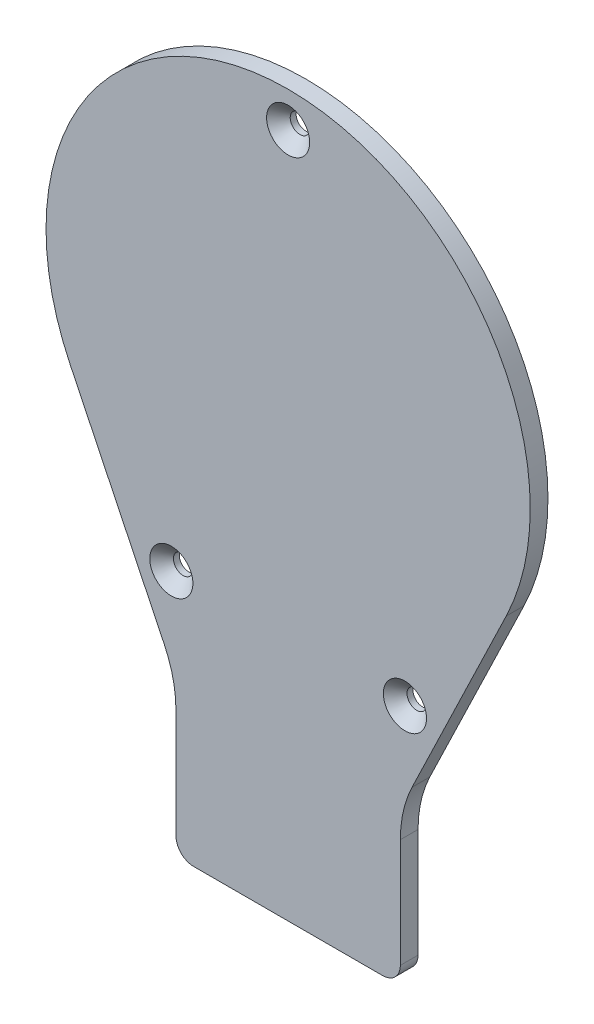
ISO-10303-21;
HEADER;
FILE_DESCRIPTION(('STEP AP214'),'2;1');
FILE_NAME('part.step','',(''),(''),'','','');
FILE_SCHEMA(('AUTOMOTIVE_DESIGN { 1 0 10303 214 1 1 1 1 }'));
ENDSEC;
DATA;
#1=APPLICATION_CONTEXT('core data for automotive mechanical design processes');
#2=APPLICATION_PROTOCOL_DEFINITION('international standard','automotive_design',2000,#1);
#3=PRODUCT_CONTEXT('',#1,'mechanical');
#4=PRODUCT('Part','Part','',(#3));
#5=PRODUCT_RELATED_PRODUCT_CATEGORY('part','',(#4));
#6=PRODUCT_DEFINITION_FORMATION('','',#4);
#7=PRODUCT_DEFINITION_CONTEXT('part definition',#1,'design');
#8=PRODUCT_DEFINITION('design','',#6,#7);
#9=PRODUCT_DEFINITION_SHAPE('','',#8);
#10=(LENGTH_UNIT() NAMED_UNIT(*) SI_UNIT(.MILLI.,.METRE.));
#11=(NAMED_UNIT(*) PLANE_ANGLE_UNIT() SI_UNIT($,.RADIAN.));
#12=(NAMED_UNIT(*) SI_UNIT($,.STERADIAN.) SOLID_ANGLE_UNIT());
#13=UNCERTAINTY_MEASURE_WITH_UNIT(LENGTH_MEASURE(1.E-05),#10,'distance_accuracy_value','');
#14=(GEOMETRIC_REPRESENTATION_CONTEXT(3) GLOBAL_UNCERTAINTY_ASSIGNED_CONTEXT((#13)) GLOBAL_UNIT_ASSIGNED_CONTEXT((#10,
#11,#12)) REPRESENTATION_CONTEXT('',''));
#15=CARTESIAN_POINT('',(0.,0.,0.));
#16=DIRECTION('',(0.,0.,1.));
#17=DIRECTION('',(1.,0.,0.));
#18=AXIS2_PLACEMENT_3D('',#15,#16,#17);
#19=CARTESIAN_POINT('',(-16.,3.,3.));
#20=DIRECTION('',(0.,0.,1.));
#21=DIRECTION('',(1.,0.,0.));
#22=AXIS2_PLACEMENT_3D('',#19,#20,#21);
#23=PLANE('',#22);
#24=CARTESIAN_POINT('',(19.7801424293768,41.4342760581103,3.));
#25=DIRECTION('',(0.,0.,1.));
#26=DIRECTION('',(1.,0.,0.));
#27=AXIS2_PLACEMENT_3D('',#24,#25,#26);
#28=CIRCLE('',#27,3.65000000000003);
#29=CARTESIAN_POINT('',(23.4301424293768,41.4342760581103,3.));
#30=VERTEX_POINT('',#29);
#31=EDGE_CURVE('E194',#30,#30,#28,.F.);
#32=ORIENTED_EDGE('',*,*,#31,.T.);
#33=EDGE_LOOP('',(#32));
#34=FACE_BOUND('',#33,.T.);
#35=CARTESIAN_POINT('',(-19.7801424293768,41.4342760581103,3.));
#36=DIRECTION('',(0.,0.,1.));
#37=DIRECTION('',(1.,0.,0.));
#38=AXIS2_PLACEMENT_3D('',#35,#36,#37);
#39=CIRCLE('',#38,3.65000000000003);
#40=CARTESIAN_POINT('',(-16.1301424293767,41.4342760581103,3.));
#41=VERTEX_POINT('',#40);
#42=EDGE_CURVE('E191',#41,#41,#39,.F.);
#43=ORIENTED_EDGE('',*,*,#42,.T.);
#44=EDGE_LOOP('',(#43));
#45=FACE_BOUND('',#44,.T.);
#46=CARTESIAN_POINT('',(0.,116.,3.));
#47=DIRECTION('',(0.,0.,1.));
#48=DIRECTION('',(1.,0.,0.));
#49=AXIS2_PLACEMENT_3D('',#46,#47,#48);
#50=CIRCLE('',#49,3.65000000000003);
#51=CARTESIAN_POINT('',(3.65000000000003,116.,3.));
#52=VERTEX_POINT('',#51);
#53=EDGE_CURVE('E188',#52,#52,#50,.F.);
#54=ORIENTED_EDGE('',*,*,#53,.T.);
#55=EDGE_LOOP('',(#54));
#56=FACE_BOUND('',#55,.T.);
#57=CARTESIAN_POINT('',(-16.,3.,3.));
#58=DIRECTION('',(0.,0.,1.));
#59=DIRECTION('',(1.,0.,0.));
#60=AXIS2_PLACEMENT_3D('',#57,#58,#59);
#61=CIRCLE('',#60,3.);
#62=CARTESIAN_POINT('',(-19.,3.,3.));
#63=VERTEX_POINT('',#62);
#64=CARTESIAN_POINT('',(-16.,0.,3.));
#65=VERTEX_POINT('',#64);
#66=EDGE_CURVE('E164',#63,#65,#61,.T.);
#67=ORIENTED_EDGE('',*,*,#66,.T.);
#68=DIRECTION('',(1.,0.,0.));
#69=VECTOR('',#68,1.);
#70=CARTESIAN_POINT('',(-16.,0.,3.));
#71=LINE('',#70,#69);
#72=CARTESIAN_POINT('',(16.,0.,3.));
#73=VERTEX_POINT('',#72);
#74=EDGE_CURVE('E103',#65,#73,#71,.T.);
#75=ORIENTED_EDGE('',*,*,#74,.T.);
#76=CARTESIAN_POINT('',(16.,3.,3.));
#77=DIRECTION('',(0.,0.,1.));
#78=DIRECTION('',(1.,0.,0.));
#79=AXIS2_PLACEMENT_3D('',#76,#77,#78);
#80=CIRCLE('',#79,3.);
#81=CARTESIAN_POINT('',(19.,3.,3.));
#82=VERTEX_POINT('',#81);
#83=EDGE_CURVE('E279',#73,#82,#80,.T.);
#84=ORIENTED_EDGE('',*,*,#83,.T.);
#85=DIRECTION('',(0.,1.,0.));
#86=VECTOR('',#85,1.);
#87=CARTESIAN_POINT('',(19.,3.,3.));
#88=LINE('',#87,#86);
#89=CARTESIAN_POINT('',(19.,21.4305485480417,3.));
#90=VERTEX_POINT('',#89);
#91=EDGE_CURVE('E281',#82,#90,#88,.T.);
#92=ORIENTED_EDGE('',*,*,#91,.T.);
#93=CARTESIAN_POINT('',(39.,21.4305485480417,3.));
#94=DIRECTION('',(0.,0.,-1.));
#95=DIRECTION('',(1.,0.,0.));
#96=AXIS2_PLACEMENT_3D('',#93,#94,#95);
#97=CIRCLE('',#96,20.);
#98=CARTESIAN_POINT('',(20.984403364283,30.1160697102486,3.));
#99=VERTEX_POINT('',#98);
#100=EDGE_CURVE('E283',#90,#99,#97,.T.);
#101=ORIENTED_EDGE('',*,*,#100,.T.);
#102=DIRECTION('',(0.434276058110342,0.900779831785849,0.));
#103=VECTOR('',#102,1.);
#104=CARTESIAN_POINT('',(20.984403364283,30.1160697102486,3.));
#105=LINE('',#104,#103);
#106=CARTESIAN_POINT('',(36.9319731032198,63.1946816174759,3.));
#107=VERTEX_POINT('',#106);
#108=EDGE_CURVE('E289',#99,#107,#105,.T.);
#109=ORIENTED_EDGE('',*,*,#108,.T.);
#110=CARTESIAN_POINT('',(0.,81.,3.));
#111=DIRECTION('',(0.,0.,1.));
#112=DIRECTION('',(1.,0.,0.));
#113=AXIS2_PLACEMENT_3D('',#110,#111,#112);
#114=CIRCLE('',#113,41.);
#115=CARTESIAN_POINT('',(-36.9319731032198,63.1946816174759,3.));
#116=VERTEX_POINT('',#115);
#117=EDGE_CURVE('E127',#107,#116,#114,.T.);
#118=ORIENTED_EDGE('',*,*,#117,.T.);
#119=DIRECTION('',(0.434276058110342,-0.900779831785849,0.));
#120=VECTOR('',#119,1.);
#121=CARTESIAN_POINT('',(-36.9319731032198,63.1946816174759,3.));
#122=LINE('',#121,#120);
#123=CARTESIAN_POINT('',(-20.984403364283,30.1160697102485,3.));
#124=VERTEX_POINT('',#123);
#125=EDGE_CURVE('E122',#116,#124,#122,.T.);
#126=ORIENTED_EDGE('',*,*,#125,.T.);
#127=CARTESIAN_POINT('',(-39.,21.4305485480417,3.));
#128=DIRECTION('',(0.,0.,-1.));
#129=DIRECTION('',(1.,0.,0.));
#130=AXIS2_PLACEMENT_3D('',#127,#128,#129);
#131=CIRCLE('',#130,20.);
#132=CARTESIAN_POINT('',(-19.,21.4305485480417,3.));
#133=VERTEX_POINT('',#132);
#134=EDGE_CURVE('E125',#124,#133,#131,.T.);
#135=ORIENTED_EDGE('',*,*,#134,.T.);
#136=DIRECTION('',(0.,-1.,0.));
#137=VECTOR('',#136,1.);
#138=CARTESIAN_POINT('',(-19.,21.4305485480417,3.));
#139=LINE('',#138,#137);
#140=EDGE_CURVE('E53',#133,#63,#139,.T.);
#141=ORIENTED_EDGE('',*,*,#140,.T.);
#142=EDGE_LOOP('',(#67,#75,#84,#92,#101,#109,#118,#126,#135,#141));
#143=FACE_BOUND('',#142,.T.);
#144=ADVANCED_FACE('F35',(#34,#45,#56,#143),#23,.T.);
#145=CARTESIAN_POINT('',(-16.,3.,0.));
#146=DIRECTION('',(0.,0.,1.));
#147=DIRECTION('',(1.,0.,0.));
#148=AXIS2_PLACEMENT_3D('',#145,#146,#147);
#149=PLANE('',#148);
#150=CARTESIAN_POINT('',(-16.,3.,0.));
#151=DIRECTION('',(0.,0.,1.));
#152=DIRECTION('',(1.,0.,0.));
#153=AXIS2_PLACEMENT_3D('',#150,#151,#152);
#154=CIRCLE('',#153,3.);
#155=CARTESIAN_POINT('',(-19.,3.,0.));
#156=VERTEX_POINT('',#155);
#157=CARTESIAN_POINT('',(-16.,0.,0.));
#158=VERTEX_POINT('',#157);
#159=EDGE_CURVE('E145',#156,#158,#154,.T.);
#160=ORIENTED_EDGE('',*,*,#159,.F.);
#161=DIRECTION('',(0.,-1.,0.));
#162=VECTOR('',#161,1.);
#163=CARTESIAN_POINT('',(-19.,21.4305485480417,0.));
#164=LINE('',#163,#162);
#165=CARTESIAN_POINT('',(-19.,21.4305485480417,0.));
#166=VERTEX_POINT('',#165);
#167=EDGE_CURVE('E94',#166,#156,#164,.T.);
#168=ORIENTED_EDGE('',*,*,#167,.F.);
#169=CARTESIAN_POINT('',(-39.,21.4305485480417,0.));
#170=DIRECTION('',(0.,0.,-1.));
#171=DIRECTION('',(1.,0.,0.));
#172=AXIS2_PLACEMENT_3D('',#169,#170,#171);
#173=CIRCLE('',#172,20.);
#174=CARTESIAN_POINT('',(-20.984403364283,30.1160697102485,0.));
#175=VERTEX_POINT('',#174);
#176=EDGE_CURVE('E88',#175,#166,#173,.T.);
#177=ORIENTED_EDGE('',*,*,#176,.F.);
#178=DIRECTION('',(0.434276058110342,-0.900779831785849,0.));
#179=VECTOR('',#178,1.);
#180=CARTESIAN_POINT('',(-36.9319731032198,63.1946816174759,0.));
#181=LINE('',#180,#179);
#182=CARTESIAN_POINT('',(-36.9319731032198,63.1946816174759,0.));
#183=VERTEX_POINT('',#182);
#184=EDGE_CURVE('E135',#183,#175,#181,.T.);
#185=ORIENTED_EDGE('',*,*,#184,.F.);
#186=CARTESIAN_POINT('',(0.,81.,0.));
#187=DIRECTION('',(0.,0.,1.));
#188=DIRECTION('',(1.,0.,0.));
#189=AXIS2_PLACEMENT_3D('',#186,#187,#188);
#190=CIRCLE('',#189,41.);
#191=CARTESIAN_POINT('',(36.9319731032198,63.1946816174759,0.));
#192=VERTEX_POINT('',#191);
#193=EDGE_CURVE('E159',#192,#183,#190,.T.);
#194=ORIENTED_EDGE('',*,*,#193,.F.);
#195=DIRECTION('',(0.434276058110342,0.900779831785849,0.));
#196=VECTOR('',#195,1.);
#197=CARTESIAN_POINT('',(20.984403364283,30.1160697102486,0.));
#198=LINE('',#197,#196);
#199=CARTESIAN_POINT('',(20.984403364283,30.1160697102486,0.));
#200=VERTEX_POINT('',#199);
#201=EDGE_CURVE('E157',#200,#192,#198,.T.);
#202=ORIENTED_EDGE('',*,*,#201,.F.);
#203=CARTESIAN_POINT('',(39.,21.4305485480417,0.));
#204=DIRECTION('',(0.,0.,-1.));
#205=DIRECTION('',(1.,0.,0.));
#206=AXIS2_PLACEMENT_3D('',#203,#204,#205);
#207=CIRCLE('',#206,20.);
#208=CARTESIAN_POINT('',(19.,21.4305485480417,0.));
#209=VERTEX_POINT('',#208);
#210=EDGE_CURVE('E155',#209,#200,#207,.T.);
#211=ORIENTED_EDGE('',*,*,#210,.F.);
#212=DIRECTION('',(0.,1.,0.));
#213=VECTOR('',#212,1.);
#214=CARTESIAN_POINT('',(19.,3.,0.));
#215=LINE('',#214,#213);
#216=CARTESIAN_POINT('',(19.,3.,0.));
#217=VERTEX_POINT('',#216);
#218=EDGE_CURVE('E153',#217,#209,#215,.T.);
#219=ORIENTED_EDGE('',*,*,#218,.F.);
#220=CARTESIAN_POINT('',(16.,3.,0.));
#221=DIRECTION('',(0.,0.,1.));
#222=DIRECTION('',(1.,0.,0.));
#223=AXIS2_PLACEMENT_3D('',#220,#221,#222);
#224=CIRCLE('',#223,3.);
#225=CARTESIAN_POINT('',(16.,0.,0.));
#226=VERTEX_POINT('',#225);
#227=EDGE_CURVE('E151',#226,#217,#224,.T.);
#228=ORIENTED_EDGE('',*,*,#227,.F.);
#229=DIRECTION('',(1.,0.,0.));
#230=VECTOR('',#229,1.);
#231=CARTESIAN_POINT('',(-16.,0.,0.));
#232=LINE('',#231,#230);
#233=EDGE_CURVE('E148',#158,#226,#232,.T.);
#234=ORIENTED_EDGE('',*,*,#233,.F.);
#235=EDGE_LOOP('',(#160,#168,#177,#185,#194,#202,#211,#219,#228,#234));
#236=FACE_BOUND('',#235,.T.);
#237=CARTESIAN_POINT('',(0.,116.,0.));
#238=DIRECTION('',(0.,0.,1.));
#239=DIRECTION('',(1.,0.,0.));
#240=AXIS2_PLACEMENT_3D('',#237,#238,#239);
#241=CIRCLE('',#240,1.65);
#242=CARTESIAN_POINT('',(1.65,116.,0.));
#243=VERTEX_POINT('',#242);
#244=EDGE_CURVE('E149',#243,#243,#241,.T.);
#245=ORIENTED_EDGE('',*,*,#244,.T.);
#246=EDGE_LOOP('',(#245));
#247=FACE_BOUND('',#246,.T.);
#248=CARTESIAN_POINT('',(19.7801424293768,41.4342760581103,0.));
#249=DIRECTION('',(0.,0.,1.));
#250=DIRECTION('',(1.,0.,0.));
#251=AXIS2_PLACEMENT_3D('',#248,#249,#250);
#252=CIRCLE('',#251,1.65);
#253=CARTESIAN_POINT('',(21.4301424293768,41.4342760581103,0.));
#254=VERTEX_POINT('',#253);
#255=EDGE_CURVE('E301',#254,#254,#252,.T.);
#256=ORIENTED_EDGE('',*,*,#255,.T.);
#257=EDGE_LOOP('',(#256));
#258=FACE_BOUND('',#257,.T.);
#259=CARTESIAN_POINT('',(-19.7801424293768,41.4342760581103,0.));
#260=DIRECTION('',(0.,0.,1.));
#261=DIRECTION('',(1.,0.,0.));
#262=AXIS2_PLACEMENT_3D('',#259,#260,#261);
#263=CIRCLE('',#262,1.65);
#264=CARTESIAN_POINT('',(-18.1301424293768,41.4342760581103,0.));
#265=VERTEX_POINT('',#264);
#266=EDGE_CURVE('E304',#265,#265,#263,.T.);
#267=ORIENTED_EDGE('',*,*,#266,.T.);
#268=EDGE_LOOP('',(#267));
#269=FACE_BOUND('',#268,.T.);
#270=ADVANCED_FACE('F216',(#236,#247,#258,#269),#149,.F.);
#271=CARTESIAN_POINT('',(-16.,3.,3.));
#272=DIRECTION('',(0.,0.,-1.));
#273=DIRECTION('',(-1.,0.,0.));
#274=AXIS2_PLACEMENT_3D('',#271,#272,#273);
#275=CYLINDRICAL_SURFACE('',#274,3.);
#276=ORIENTED_EDGE('',*,*,#159,.T.);
#277=DIRECTION('',(0.,0.,-1.));
#278=VECTOR('',#277,1.);
#279=CARTESIAN_POINT('',(-16.,0.,3.));
#280=LINE('',#279,#278);
#281=EDGE_CURVE('E183',#65,#158,#280,.T.);
#282=ORIENTED_EDGE('',*,*,#281,.F.);
#283=ORIENTED_EDGE('',*,*,#66,.F.);
#284=DIRECTION('',(0.,0.,-1.));
#285=VECTOR('',#284,1.);
#286=CARTESIAN_POINT('',(-19.,3.,3.));
#287=LINE('',#286,#285);
#288=EDGE_CURVE('E141',#63,#156,#287,.T.);
#289=ORIENTED_EDGE('',*,*,#288,.T.);
#290=EDGE_LOOP('',(#276,#282,#283,#289));
#291=FACE_BOUND('',#290,.T.);
#292=ADVANCED_FACE('F222',(#291),#275,.T.);
#293=CARTESIAN_POINT('',(-16.,0.,3.));
#294=DIRECTION('',(0.,1.,0.));
#295=DIRECTION('',(0.,0.,1.));
#296=AXIS2_PLACEMENT_3D('',#293,#294,#295);
#297=PLANE('',#296);
#298=ORIENTED_EDGE('',*,*,#233,.T.);
#299=DIRECTION('',(0.,0.,-1.));
#300=VECTOR('',#299,1.);
#301=CARTESIAN_POINT('',(16.,0.,3.));
#302=LINE('',#301,#300);
#303=EDGE_CURVE('E180',#73,#226,#302,.T.);
#304=ORIENTED_EDGE('',*,*,#303,.F.);
#305=ORIENTED_EDGE('',*,*,#74,.F.);
#306=ORIENTED_EDGE('',*,*,#281,.T.);
#307=EDGE_LOOP('',(#298,#304,#305,#306));
#308=FACE_BOUND('',#307,.T.);
#309=ADVANCED_FACE('F256',(#308),#297,.F.);
#310=CARTESIAN_POINT('',(16.,3.,3.));
#311=DIRECTION('',(0.,0.,-1.));
#312=DIRECTION('',(-1.,0.,0.));
#313=AXIS2_PLACEMENT_3D('',#310,#311,#312);
#314=CYLINDRICAL_SURFACE('',#313,3.);
#315=ORIENTED_EDGE('',*,*,#227,.T.);
#316=DIRECTION('',(0.,0.,-1.));
#317=VECTOR('',#316,1.);
#318=CARTESIAN_POINT('',(19.,3.,3.));
#319=LINE('',#318,#317);
#320=EDGE_CURVE('E177',#82,#217,#319,.T.);
#321=ORIENTED_EDGE('',*,*,#320,.F.);
#322=ORIENTED_EDGE('',*,*,#83,.F.);
#323=ORIENTED_EDGE('',*,*,#303,.T.);
#324=EDGE_LOOP('',(#315,#321,#322,#323));
#325=FACE_BOUND('',#324,.T.);
#326=ADVANCED_FACE('F252',(#325),#314,.T.);
#327=CARTESIAN_POINT('',(19.,3.,3.));
#328=DIRECTION('',(-1.,0.,0.));
#329=DIRECTION('',(0.,0.,1.));
#330=AXIS2_PLACEMENT_3D('',#327,#328,#329);
#331=PLANE('',#330);
#332=ORIENTED_EDGE('',*,*,#218,.T.);
#333=DIRECTION('',(0.,0.,-1.));
#334=VECTOR('',#333,1.);
#335=CARTESIAN_POINT('',(19.,21.4305485480417,3.));
#336=LINE('',#335,#334);
#337=EDGE_CURVE('E174',#90,#209,#336,.T.);
#338=ORIENTED_EDGE('',*,*,#337,.F.);
#339=ORIENTED_EDGE('',*,*,#91,.F.);
#340=ORIENTED_EDGE('',*,*,#320,.T.);
#341=EDGE_LOOP('',(#332,#338,#339,#340));
#342=FACE_BOUND('',#341,.T.);
#343=ADVANCED_FACE('F248',(#342),#331,.F.);
#344=CARTESIAN_POINT('',(39.,21.4305485480417,3.));
#345=DIRECTION('',(0.,0.,-1.));
#346=DIRECTION('',(-1.,0.,0.));
#347=AXIS2_PLACEMENT_3D('',#344,#345,#346);
#348=CYLINDRICAL_SURFACE('',#347,20.);
#349=ORIENTED_EDGE('',*,*,#210,.T.);
#350=DIRECTION('',(0.,0.,-1.));
#351=VECTOR('',#350,1.);
#352=CARTESIAN_POINT('',(20.984403364283,30.1160697102486,3.));
#353=LINE('',#352,#351);
#354=EDGE_CURVE('E171',#99,#200,#353,.T.);
#355=ORIENTED_EDGE('',*,*,#354,.F.);
#356=ORIENTED_EDGE('',*,*,#100,.F.);
#357=ORIENTED_EDGE('',*,*,#337,.T.);
#358=EDGE_LOOP('',(#349,#355,#356,#357));
#359=FACE_BOUND('',#358,.T.);
#360=ADVANCED_FACE('F244',(#359),#348,.F.);
#361=CARTESIAN_POINT('',(20.984403364283,30.1160697102486,3.));
#362=DIRECTION('',(-0.900779831785849,0.434276058110342,0.));
#363=DIRECTION('',(-0.434276058110343,-0.900779831785849,0.));
#364=AXIS2_PLACEMENT_3D('',#361,#362,#363);
#365=PLANE('',#364);
#366=ORIENTED_EDGE('',*,*,#201,.T.);
#367=DIRECTION('',(0.,0.,-1.));
#368=VECTOR('',#367,1.);
#369=CARTESIAN_POINT('',(36.9319731032198,63.1946816174759,3.));
#370=LINE('',#369,#368);
#371=EDGE_CURVE('E168',#107,#192,#370,.T.);
#372=ORIENTED_EDGE('',*,*,#371,.F.);
#373=ORIENTED_EDGE('',*,*,#108,.F.);
#374=ORIENTED_EDGE('',*,*,#354,.T.);
#375=EDGE_LOOP('',(#366,#372,#373,#374));
#376=FACE_BOUND('',#375,.T.);
#377=ADVANCED_FACE('F240',(#376),#365,.F.);
#378=CARTESIAN_POINT('',(0.,81.,3.));
#379=DIRECTION('',(0.,0.,-1.));
#380=DIRECTION('',(-1.,0.,0.));
#381=AXIS2_PLACEMENT_3D('',#378,#379,#380);
#382=CYLINDRICAL_SURFACE('',#381,41.);
#383=ORIENTED_EDGE('',*,*,#193,.T.);
#384=DIRECTION('',(0.,0.,-1.));
#385=VECTOR('',#384,1.);
#386=CARTESIAN_POINT('',(-36.9319731032198,63.1946816174759,3.));
#387=LINE('',#386,#385);
#388=EDGE_CURVE('E136',#116,#183,#387,.T.);
#389=ORIENTED_EDGE('',*,*,#388,.F.);
#390=ORIENTED_EDGE('',*,*,#117,.F.);
#391=ORIENTED_EDGE('',*,*,#371,.T.);
#392=EDGE_LOOP('',(#383,#389,#390,#391));
#393=FACE_BOUND('',#392,.T.);
#394=ADVANCED_FACE('F237',(#393),#382,.T.);
#395=CARTESIAN_POINT('',(-36.9319731032198,63.1946816174759,3.));
#396=DIRECTION('',(0.900779831785849,0.434276058110342,0.));
#397=DIRECTION('',(-0.434276058110342,0.900779831785849,0.));
#398=AXIS2_PLACEMENT_3D('',#395,#396,#397);
#399=PLANE('',#398);
#400=ORIENTED_EDGE('',*,*,#184,.T.);
#401=DIRECTION('',(0.,0.,-1.));
#402=VECTOR('',#401,1.);
#403=CARTESIAN_POINT('',(-20.984403364283,30.1160697102485,3.));
#404=LINE('',#403,#402);
#405=EDGE_CURVE('E132',#124,#175,#404,.T.);
#406=ORIENTED_EDGE('',*,*,#405,.F.);
#407=ORIENTED_EDGE('',*,*,#125,.F.);
#408=ORIENTED_EDGE('',*,*,#388,.T.);
#409=EDGE_LOOP('',(#400,#406,#407,#408));
#410=FACE_BOUND('',#409,.T.);
#411=ADVANCED_FACE('F133',(#410),#399,.F.);
#412=CARTESIAN_POINT('',(-39.,21.4305485480417,3.));
#413=DIRECTION('',(0.,0.,-1.));
#414=DIRECTION('',(-1.,0.,0.));
#415=AXIS2_PLACEMENT_3D('',#412,#413,#414);
#416=CYLINDRICAL_SURFACE('',#415,20.);
#417=ORIENTED_EDGE('',*,*,#176,.T.);
#418=DIRECTION('',(0.,0.,-1.));
#419=VECTOR('',#418,1.);
#420=CARTESIAN_POINT('',(-19.,21.4305485480417,3.));
#421=LINE('',#420,#419);
#422=EDGE_CURVE('E137',#133,#166,#421,.T.);
#423=ORIENTED_EDGE('',*,*,#422,.F.);
#424=ORIENTED_EDGE('',*,*,#134,.F.);
#425=ORIENTED_EDGE('',*,*,#405,.T.);
#426=EDGE_LOOP('',(#417,#423,#424,#425));
#427=FACE_BOUND('',#426,.T.);
#428=ADVANCED_FACE('F139',(#427),#416,.F.);
#429=CARTESIAN_POINT('',(-19.,21.4305485480417,3.));
#430=DIRECTION('',(1.,0.,0.));
#431=DIRECTION('',(0.,1.,0.));
#432=AXIS2_PLACEMENT_3D('',#429,#430,#431);
#433=PLANE('',#432);
#434=ORIENTED_EDGE('',*,*,#167,.T.);
#435=ORIENTED_EDGE('',*,*,#288,.F.);
#436=ORIENTED_EDGE('',*,*,#140,.F.);
#437=ORIENTED_EDGE('',*,*,#422,.T.);
#438=EDGE_LOOP('',(#434,#435,#436,#437));
#439=FACE_BOUND('',#438,.T.);
#440=ADVANCED_FACE('F230',(#439),#433,.F.);
#441=CARTESIAN_POINT('',(0.,116.,3.));
#442=DIRECTION('',(0.,0.,-1.));
#443=DIRECTION('',(-1.,0.,0.));
#444=AXIS2_PLACEMENT_3D('',#441,#442,#443);
#445=CYLINDRICAL_SURFACE('',#444,1.65);
#446=CARTESIAN_POINT('',(0.,116.,0.99999999999998));
#447=DIRECTION('',(0.,0.,1.));
#448=DIRECTION('',(1.,0.,0.));
#449=AXIS2_PLACEMENT_3D('',#446,#447,#448);
#450=CIRCLE('',#449,1.65);
#451=CARTESIAN_POINT('',(1.65,116.,0.99999999999998));
#452=VERTEX_POINT('',#451);
#453=EDGE_CURVE('E11',#452,#452,#450,.T.);
#454=ORIENTED_EDGE('',*,*,#453,.T.);
#455=EDGE_LOOP('',(#454));
#456=FACE_BOUND('',#455,.T.);
#457=ORIENTED_EDGE('',*,*,#244,.F.);
#458=EDGE_LOOP('',(#457));
#459=FACE_BOUND('',#458,.T.);
#460=ADVANCED_FACE('F227',(#456,#459),#445,.F.);
#461=CARTESIAN_POINT('',(19.7801424293768,41.4342760581103,3.));
#462=DIRECTION('',(0.,0.,-1.));
#463=DIRECTION('',(-1.,0.,0.));
#464=AXIS2_PLACEMENT_3D('',#461,#462,#463);
#465=CYLINDRICAL_SURFACE('',#464,1.65);
#466=CARTESIAN_POINT('',(19.7801424293768,41.4342760581103,0.999999999999964));
#467=DIRECTION('',(0.,0.,1.));
#468=DIRECTION('',(1.,0.,0.));
#469=AXIS2_PLACEMENT_3D('',#466,#467,#468);
#470=CIRCLE('',#469,1.65);
#471=CARTESIAN_POINT('',(21.4301424293768,41.4342760581103,0.999999999999964));
#472=VERTEX_POINT('',#471);
#473=EDGE_CURVE('E185',#472,#472,#470,.T.);
#474=ORIENTED_EDGE('',*,*,#473,.T.);
#475=EDGE_LOOP('',(#474));
#476=FACE_BOUND('',#475,.T.);
#477=ORIENTED_EDGE('',*,*,#255,.F.);
#478=EDGE_LOOP('',(#477));
#479=FACE_BOUND('',#478,.T.);
#480=ADVANCED_FACE('F309',(#476,#479),#465,.F.);
#481=CARTESIAN_POINT('',(-19.7801424293768,41.4342760581103,3.));
#482=DIRECTION('',(0.,0.,-1.));
#483=DIRECTION('',(-1.,0.,0.));
#484=AXIS2_PLACEMENT_3D('',#481,#482,#483);
#485=CYLINDRICAL_SURFACE('',#484,1.65);
#486=CARTESIAN_POINT('',(-19.7801424293768,41.4342760581103,0.999999999999964));
#487=DIRECTION('',(0.,0.,1.));
#488=DIRECTION('',(1.,0.,0.));
#489=AXIS2_PLACEMENT_3D('',#486,#487,#488);
#490=CIRCLE('',#489,1.65);
#491=CARTESIAN_POINT('',(-18.1301424293768,41.4342760581103,0.999999999999964));
#492=VERTEX_POINT('',#491);
#493=EDGE_CURVE('E45',#492,#492,#490,.T.);
#494=ORIENTED_EDGE('',*,*,#493,.T.);
#495=EDGE_LOOP('',(#494));
#496=FACE_BOUND('',#495,.T.);
#497=ORIENTED_EDGE('',*,*,#266,.F.);
#498=EDGE_LOOP('',(#497));
#499=FACE_BOUND('',#498,.T.);
#500=ADVANCED_FACE('F199',(#496,#499),#485,.F.);
#501=CARTESIAN_POINT('',(19.7801424293768,41.4342760581103,0.999999999999964));
#502=DIRECTION('',(0.,0.,1.));
#503=DIRECTION('',(1.,0.,0.));
#504=AXIS2_PLACEMENT_3D('',#501,#502,#503);
#505=CONICAL_SURFACE('',#504,1.65,0.785398163397447);
#506=ORIENTED_EDGE('',*,*,#31,.F.);
#507=EDGE_LOOP('',(#506));
#508=FACE_BOUND('',#507,.T.);
#509=ORIENTED_EDGE('',*,*,#473,.F.);
#510=EDGE_LOOP('',(#509));
#511=FACE_BOUND('',#510,.T.);
#512=ADVANCED_FACE('F204',(#508,#511),#505,.F.);
#513=CARTESIAN_POINT('',(-19.7801424293768,41.4342760581103,0.999999999999964));
#514=DIRECTION('',(0.,0.,1.));
#515=DIRECTION('',(1.,0.,0.));
#516=AXIS2_PLACEMENT_3D('',#513,#514,#515);
#517=CONICAL_SURFACE('',#516,1.65,0.785398163397447);
#518=ORIENTED_EDGE('',*,*,#42,.F.);
#519=EDGE_LOOP('',(#518));
#520=FACE_BOUND('',#519,.T.);
#521=ORIENTED_EDGE('',*,*,#493,.F.);
#522=EDGE_LOOP('',(#521));
#523=FACE_BOUND('',#522,.T.);
#524=ADVANCED_FACE('F202',(#520,#523),#517,.F.);
#525=CARTESIAN_POINT('',(0.,116.,0.99999999999998));
#526=DIRECTION('',(0.,0.,1.));
#527=DIRECTION('',(1.,0.,0.));
#528=AXIS2_PLACEMENT_3D('',#525,#526,#527);
#529=CONICAL_SURFACE('',#528,1.65,0.78539816339745);
#530=ORIENTED_EDGE('',*,*,#53,.F.);
#531=EDGE_LOOP('',(#530));
#532=FACE_BOUND('',#531,.T.);
#533=ORIENTED_EDGE('',*,*,#453,.F.);
#534=EDGE_LOOP('',(#533));
#535=FACE_BOUND('',#534,.T.);
#536=ADVANCED_FACE('F38',(#532,#535),#529,.F.);
#537=CLOSED_SHELL('',(#144,#270,#292,#309,#326,#343,#360,#377,#394,#411,#428,#440,#460,#480,
#500,#512,#524,#536));
#538=MANIFOLD_SOLID_BREP('B2',#537);
#539=ADVANCED_BREP_SHAPE_REPRESENTATION('',(#18,#538),#14);
#540=SHAPE_DEFINITION_REPRESENTATION(#9,#539);
ENDSEC;
END-ISO-10303-21;
